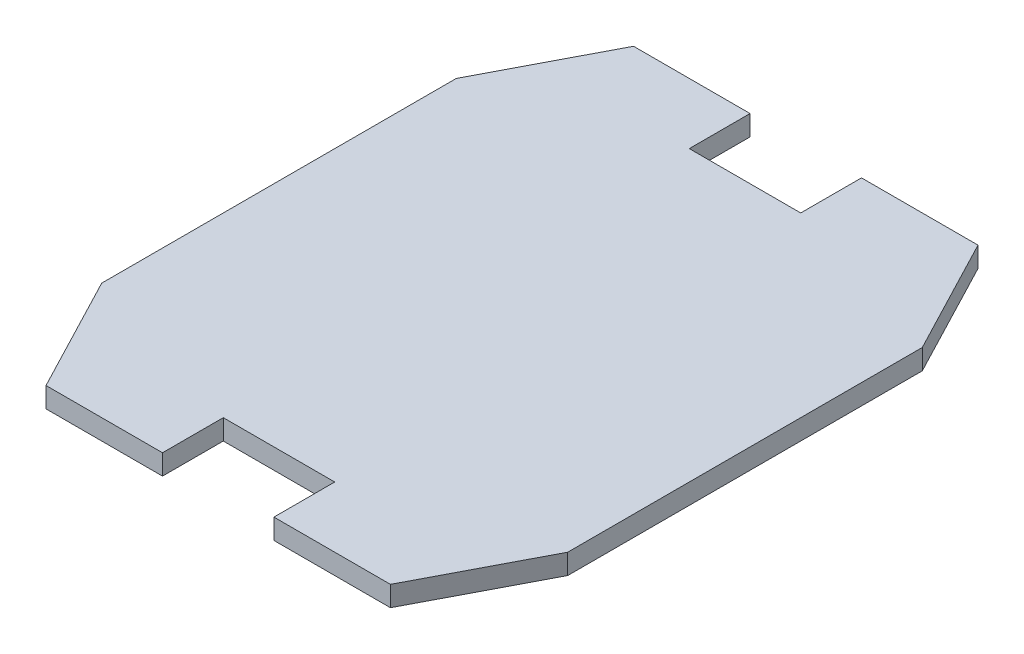
ISO-10303-21;
HEADER;
FILE_DESCRIPTION(('STEP AP214'),'2;1');
FILE_NAME('part.step','',(''),(''),'','','');
FILE_SCHEMA(('AUTOMOTIVE_DESIGN { 1 0 10303 214 1 1 1 1 }'));
ENDSEC;
DATA;
#1=APPLICATION_CONTEXT('core data for automotive mechanical design processes');
#2=APPLICATION_PROTOCOL_DEFINITION('international standard','automotive_design',2000,#1);
#3=PRODUCT_CONTEXT('',#1,'mechanical');
#4=PRODUCT('Part','Part','',(#3));
#5=PRODUCT_RELATED_PRODUCT_CATEGORY('part','',(#4));
#6=PRODUCT_DEFINITION_FORMATION('','',#4);
#7=PRODUCT_DEFINITION_CONTEXT('part definition',#1,'design');
#8=PRODUCT_DEFINITION('design','',#6,#7);
#9=PRODUCT_DEFINITION_SHAPE('','',#8);
#10=(LENGTH_UNIT() NAMED_UNIT(*) SI_UNIT(.MILLI.,.METRE.));
#11=(NAMED_UNIT(*) PLANE_ANGLE_UNIT() SI_UNIT($,.RADIAN.));
#12=(NAMED_UNIT(*) SI_UNIT($,.STERADIAN.) SOLID_ANGLE_UNIT());
#13=UNCERTAINTY_MEASURE_WITH_UNIT(LENGTH_MEASURE(1.E-05),#10,'distance_accuracy_value','');
#14=(GEOMETRIC_REPRESENTATION_CONTEXT(3) GLOBAL_UNCERTAINTY_ASSIGNED_CONTEXT((#13)) GLOBAL_UNIT_ASSIGNED_CONTEXT((#10,
#11,#12)) REPRESENTATION_CONTEXT('',''));
#15=CARTESIAN_POINT('',(0.,0.,0.));
#16=DIRECTION('',(0.,0.,1.));
#17=DIRECTION('',(1.,0.,0.));
#18=AXIS2_PLACEMENT_3D('',#15,#16,#17);
#19=CARTESIAN_POINT('',(-155.,10.,-145.));
#20=DIRECTION('',(0.,0.,1.));
#21=DIRECTION('',(1.,0.,0.));
#22=AXIS2_PLACEMENT_3D('',#19,#20,#21);
#23=PLANE('',#22);
#24=DIRECTION('',(0.,1.,0.));
#25=VECTOR('',#24,1.);
#26=CARTESIAN_POINT('',(-27.5,0.,-145.));
#27=LINE('',#26,#25);
#28=CARTESIAN_POINT('',(-27.5,0.,-145.));
#29=VERTEX_POINT('',#28);
#30=CARTESIAN_POINT('',(-27.5,10.,-145.));
#31=VERTEX_POINT('',#30);
#32=EDGE_CURVE('E158',#29,#31,#27,.T.);
#33=ORIENTED_EDGE('',*,*,#32,.F.);
#34=DIRECTION('',(-1.,0.,0.));
#35=VECTOR('',#34,1.);
#36=CARTESIAN_POINT('',(-155.,0.,-145.));
#37=LINE('',#36,#35);
#38=CARTESIAN_POINT('',(-85.,0.,-145.));
#39=VERTEX_POINT('',#38);
#40=EDGE_CURVE('E180',#29,#39,#37,.T.);
#41=ORIENTED_EDGE('',*,*,#40,.T.);
#42=DIRECTION('',(0.,1.,0.));
#43=VECTOR('',#42,1.);
#44=CARTESIAN_POINT('',(-85.,0.,-145.));
#45=LINE('',#44,#43);
#46=CARTESIAN_POINT('',(-85.,10.,-145.));
#47=VERTEX_POINT('',#46);
#48=EDGE_CURVE('E178',#39,#47,#45,.T.);
#49=ORIENTED_EDGE('',*,*,#48,.T.);
#50=DIRECTION('',(-1.,0.,0.));
#51=VECTOR('',#50,1.);
#52=CARTESIAN_POINT('',(-155.,10.,-145.));
#53=LINE('',#52,#51);
#54=EDGE_CURVE('E185',#31,#47,#53,.T.);
#55=ORIENTED_EDGE('',*,*,#54,.F.);
#56=EDGE_LOOP('',(#33,#41,#49,#55));
#57=FACE_BOUND('',#56,.T.);
#58=ADVANCED_FACE('F39',(#57),#23,.F.);
#59=CARTESIAN_POINT('',(-155.,10.,145.));
#60=DIRECTION('',(0.,0.,-1.));
#61=DIRECTION('',(-1.,0.,0.));
#62=AXIS2_PLACEMENT_3D('',#59,#60,#61);
#63=PLANE('',#62);
#64=DIRECTION('',(0.,1.,0.));
#65=VECTOR('',#64,1.);
#66=CARTESIAN_POINT('',(27.5,0.,145.));
#67=LINE('',#66,#65);
#68=CARTESIAN_POINT('',(27.5,0.,145.));
#69=VERTEX_POINT('',#68);
#70=CARTESIAN_POINT('',(27.5,10.,145.));
#71=VERTEX_POINT('',#70);
#72=EDGE_CURVE('E243',#69,#71,#67,.T.);
#73=ORIENTED_EDGE('',*,*,#72,.F.);
#74=DIRECTION('',(1.,0.,0.));
#75=VECTOR('',#74,1.);
#76=CARTESIAN_POINT('',(-155.,0.,145.));
#77=LINE('',#76,#75);
#78=CARTESIAN_POINT('',(85.,0.,145.));
#79=VERTEX_POINT('',#78);
#80=EDGE_CURVE('E176',#69,#79,#77,.T.);
#81=ORIENTED_EDGE('',*,*,#80,.T.);
#82=DIRECTION('',(0.,1.,0.));
#83=VECTOR('',#82,1.);
#84=CARTESIAN_POINT('',(85.,0.,145.));
#85=LINE('',#84,#83);
#86=CARTESIAN_POINT('',(85.,10.,145.));
#87=VERTEX_POINT('',#86);
#88=EDGE_CURVE('E202',#79,#87,#85,.T.);
#89=ORIENTED_EDGE('',*,*,#88,.T.);
#90=DIRECTION('',(1.,0.,0.));
#91=VECTOR('',#90,1.);
#92=CARTESIAN_POINT('',(-155.,10.,145.));
#93=LINE('',#92,#91);
#94=EDGE_CURVE('E48',#71,#87,#93,.T.);
#95=ORIENTED_EDGE('',*,*,#94,.F.);
#96=EDGE_LOOP('',(#73,#81,#89,#95));
#97=FACE_BOUND('',#96,.T.);
#98=ADVANCED_FACE('F319',(#97),#63,.F.);
#99=CARTESIAN_POINT('',(85.,0.,-145.));
#100=VERTEX_POINT('',#99);
#101=CARTESIAN_POINT('',(27.5,0.,-145.));
#102=VERTEX_POINT('',#101);
#103=EDGE_CURVE('E166',#100,#102,#37,.T.);
#104=ORIENTED_EDGE('',*,*,#103,.T.);
#105=DIRECTION('',(0.,1.,0.));
#106=VECTOR('',#105,1.);
#107=CARTESIAN_POINT('',(27.5,0.,-145.));
#108=LINE('',#107,#106);
#109=CARTESIAN_POINT('',(27.5,10.,-145.));
#110=VERTEX_POINT('',#109);
#111=EDGE_CURVE('E152',#102,#110,#108,.T.);
#112=ORIENTED_EDGE('',*,*,#111,.T.);
#113=CARTESIAN_POINT('',(85.,10.,-145.));
#114=VERTEX_POINT('',#113);
#115=EDGE_CURVE('E179',#114,#110,#53,.T.);
#116=ORIENTED_EDGE('',*,*,#115,.F.);
#117=DIRECTION('',(0.,1.,0.));
#118=VECTOR('',#117,1.);
#119=CARTESIAN_POINT('',(85.,0.,-145.));
#120=LINE('',#119,#118);
#121=EDGE_CURVE('E174',#100,#114,#120,.T.);
#122=ORIENTED_EDGE('',*,*,#121,.F.);
#123=EDGE_LOOP('',(#104,#112,#116,#122));
#124=FACE_BOUND('',#123,.T.);
#125=ADVANCED_FACE('F41',(#124),#23,.F.);
#126=CARTESIAN_POINT('',(-85.,0.,145.));
#127=VERTEX_POINT('',#126);
#128=CARTESIAN_POINT('',(-27.5,0.,145.));
#129=VERTEX_POINT('',#128);
#130=EDGE_CURVE('E43',#127,#129,#77,.T.);
#131=ORIENTED_EDGE('',*,*,#130,.T.);
#132=DIRECTION('',(0.,1.,0.));
#133=VECTOR('',#132,1.);
#134=CARTESIAN_POINT('',(-27.5,0.,145.));
#135=LINE('',#134,#133);
#136=CARTESIAN_POINT('',(-27.5,10.,145.));
#137=VERTEX_POINT('',#136);
#138=EDGE_CURVE('E252',#129,#137,#135,.T.);
#139=ORIENTED_EDGE('',*,*,#138,.T.);
#140=CARTESIAN_POINT('',(-85.,10.,145.));
#141=VERTEX_POINT('',#140);
#142=EDGE_CURVE('E11',#141,#137,#93,.T.);
#143=ORIENTED_EDGE('',*,*,#142,.F.);
#144=DIRECTION('',(0.,1.,0.));
#145=VECTOR('',#144,1.);
#146=CARTESIAN_POINT('',(-85.,0.,145.));
#147=LINE('',#146,#145);
#148=EDGE_CURVE('E208',#127,#141,#147,.T.);
#149=ORIENTED_EDGE('',*,*,#148,.F.);
#150=EDGE_LOOP('',(#131,#139,#143,#149));
#151=FACE_BOUND('',#150,.T.);
#152=ADVANCED_FACE('F283',(#151),#63,.F.);
#153=CARTESIAN_POINT('',(0.,10.,0.));
#154=DIRECTION('',(0.,1.,0.));
#155=DIRECTION('',(0.,0.,1.));
#156=AXIS2_PLACEMENT_3D('',#153,#154,#155);
#157=PLANE('',#156);
#158=DIRECTION('',(0.,0.,-1.));
#159=VECTOR('',#158,1.);
#160=CARTESIAN_POINT('',(27.5,10.,145.));
#161=LINE('',#160,#159);
#162=CARTESIAN_POINT('',(27.5,10.,115.));
#163=VERTEX_POINT('',#162);
#164=EDGE_CURVE('E242',#71,#163,#161,.T.);
#165=ORIENTED_EDGE('',*,*,#164,.F.);
#166=ORIENTED_EDGE('',*,*,#94,.T.);
#167=DIRECTION('',(-0.462566006718739,0.,0.886584846153079));
#168=VECTOR('',#167,1.);
#169=CARTESIAN_POINT('',(115.000000001957,10.,87.5));
#170=LINE('',#169,#168);
#171=CARTESIAN_POINT('',(115.000000001957,10.,87.5));
#172=VERTEX_POINT('',#171);
#173=EDGE_CURVE('E184',#172,#87,#170,.T.);
#174=ORIENTED_EDGE('',*,*,#173,.F.);
#175=DIRECTION('',(0.,0.,1.));
#176=VECTOR('',#175,1.);
#177=CARTESIAN_POINT('',(115.000000001957,10.,-87.5));
#178=LINE('',#177,#176);
#179=CARTESIAN_POINT('',(115.000000001957,10.,-87.5));
#180=VERTEX_POINT('',#179);
#181=EDGE_CURVE('E196',#180,#172,#178,.T.);
#182=ORIENTED_EDGE('',*,*,#181,.F.);
#183=DIRECTION('',(0.462566006718739,0.,0.886584846153079));
#184=VECTOR('',#183,1.);
#185=CARTESIAN_POINT('',(85.,10.,-145.));
#186=LINE('',#185,#184);
#187=EDGE_CURVE('E191',#114,#180,#186,.T.);
#188=ORIENTED_EDGE('',*,*,#187,.F.);
#189=ORIENTED_EDGE('',*,*,#115,.T.);
#190=DIRECTION('',(0.,0.,-1.));
#191=VECTOR('',#190,1.);
#192=CARTESIAN_POINT('',(27.5,10.,-145.));
#193=LINE('',#192,#191);
#194=CARTESIAN_POINT('',(27.5,10.,-115.));
#195=VERTEX_POINT('',#194);
#196=EDGE_CURVE('E155',#195,#110,#193,.T.);
#197=ORIENTED_EDGE('',*,*,#196,.F.);
#198=DIRECTION('',(1.,0.,0.));
#199=VECTOR('',#198,1.);
#200=CARTESIAN_POINT('',(27.5,10.,-115.));
#201=LINE('',#200,#199);
#202=CARTESIAN_POINT('',(-27.5,10.,-115.));
#203=VERTEX_POINT('',#202);
#204=EDGE_CURVE('E175',#203,#195,#201,.T.);
#205=ORIENTED_EDGE('',*,*,#204,.F.);
#206=DIRECTION('',(0.,0.,1.));
#207=VECTOR('',#206,1.);
#208=CARTESIAN_POINT('',(-27.5,10.,-145.));
#209=LINE('',#208,#207);
#210=EDGE_CURVE('E265',#31,#203,#209,.T.);
#211=ORIENTED_EDGE('',*,*,#210,.F.);
#212=ORIENTED_EDGE('',*,*,#54,.T.);
#213=DIRECTION('',(0.462566006718739,0.,-0.886584846153079));
#214=VECTOR('',#213,1.);
#215=CARTESIAN_POINT('',(-85.,10.,-145.));
#216=LINE('',#215,#214);
#217=CARTESIAN_POINT('',(-115.000000001957,10.,-87.5));
#218=VERTEX_POINT('',#217);
#219=EDGE_CURVE('E218',#218,#47,#216,.T.);
#220=ORIENTED_EDGE('',*,*,#219,.F.);
#221=DIRECTION('',(0.,0.,-1.));
#222=VECTOR('',#221,1.);
#223=CARTESIAN_POINT('',(-115.000000001957,10.,-87.5));
#224=LINE('',#223,#222);
#225=CARTESIAN_POINT('',(-115.000000001957,10.,87.5));
#226=VERTEX_POINT('',#225);
#227=EDGE_CURVE('E225',#226,#218,#224,.T.);
#228=ORIENTED_EDGE('',*,*,#227,.F.);
#229=DIRECTION('',(-0.462566006718739,0.,-0.886584846153079));
#230=VECTOR('',#229,1.);
#231=CARTESIAN_POINT('',(-115.000000001957,10.,87.5));
#232=LINE('',#231,#230);
#233=EDGE_CURVE('E192',#141,#226,#232,.T.);
#234=ORIENTED_EDGE('',*,*,#233,.F.);
#235=ORIENTED_EDGE('',*,*,#142,.T.);
#236=DIRECTION('',(0.,0.,1.));
#237=VECTOR('',#236,1.);
#238=CARTESIAN_POINT('',(-27.5,10.,145.));
#239=LINE('',#238,#237);
#240=CARTESIAN_POINT('',(-27.5,10.,115.));
#241=VERTEX_POINT('',#240);
#242=EDGE_CURVE('E238',#241,#137,#239,.T.);
#243=ORIENTED_EDGE('',*,*,#242,.F.);
#244=DIRECTION('',(-1.,0.,0.));
#245=VECTOR('',#244,1.);
#246=CARTESIAN_POINT('',(27.5,10.,115.));
#247=LINE('',#246,#245);
#248=EDGE_CURVE('E250',#163,#241,#247,.T.);
#249=ORIENTED_EDGE('',*,*,#248,.F.);
#250=EDGE_LOOP('',(#165,#166,#174,#182,#188,#189,#197,#205,#211,#212,#220,#228,#234,#235,#243,#249));
#251=FACE_BOUND('',#250,.T.);
#252=ADVANCED_FACE('F295',(#251),#157,.T.);
#253=CARTESIAN_POINT('',(0.,0.,0.));
#254=DIRECTION('',(0.,1.,0.));
#255=DIRECTION('',(0.,0.,1.));
#256=AXIS2_PLACEMENT_3D('',#253,#254,#255);
#257=PLANE('',#256);
#258=DIRECTION('',(1.,0.,0.));
#259=VECTOR('',#258,1.);
#260=CARTESIAN_POINT('',(27.5,0.,-115.));
#261=LINE('',#260,#259);
#262=CARTESIAN_POINT('',(-27.5,0.,-115.));
#263=VERTEX_POINT('',#262);
#264=CARTESIAN_POINT('',(27.5,0.,-115.));
#265=VERTEX_POINT('',#264);
#266=EDGE_CURVE('E163',#263,#265,#261,.T.);
#267=ORIENTED_EDGE('',*,*,#266,.T.);
#268=DIRECTION('',(0.,0.,-1.));
#269=VECTOR('',#268,1.);
#270=CARTESIAN_POINT('',(27.5,0.,-145.));
#271=LINE('',#270,#269);
#272=EDGE_CURVE('E57',#265,#102,#271,.T.);
#273=ORIENTED_EDGE('',*,*,#272,.T.);
#274=ORIENTED_EDGE('',*,*,#103,.F.);
#275=DIRECTION('',(0.462566006718739,0.,0.886584846153079));
#276=VECTOR('',#275,1.);
#277=CARTESIAN_POINT('',(85.,0.,-145.));
#278=LINE('',#277,#276);
#279=CARTESIAN_POINT('',(115.000000001957,0.,-87.5));
#280=VERTEX_POINT('',#279);
#281=EDGE_CURVE('E182',#100,#280,#278,.T.);
#282=ORIENTED_EDGE('',*,*,#281,.T.);
#283=DIRECTION('',(0.,0.,1.));
#284=VECTOR('',#283,1.);
#285=CARTESIAN_POINT('',(115.000000001957,0.,-87.5));
#286=LINE('',#285,#284);
#287=CARTESIAN_POINT('',(115.000000001957,0.,87.5));
#288=VERTEX_POINT('',#287);
#289=EDGE_CURVE('E187',#280,#288,#286,.T.);
#290=ORIENTED_EDGE('',*,*,#289,.T.);
#291=DIRECTION('',(-0.462566006718739,0.,0.886584846153079));
#292=VECTOR('',#291,1.);
#293=CARTESIAN_POINT('',(115.000000001957,0.,87.5));
#294=LINE('',#293,#292);
#295=EDGE_CURVE('E186',#288,#79,#294,.T.);
#296=ORIENTED_EDGE('',*,*,#295,.T.);
#297=ORIENTED_EDGE('',*,*,#80,.F.);
#298=DIRECTION('',(0.,0.,-1.));
#299=VECTOR('',#298,1.);
#300=CARTESIAN_POINT('',(27.5,0.,145.));
#301=LINE('',#300,#299);
#302=CARTESIAN_POINT('',(27.5,0.,115.));
#303=VERTEX_POINT('',#302);
#304=EDGE_CURVE('E232',#69,#303,#301,.T.);
#305=ORIENTED_EDGE('',*,*,#304,.T.);
#306=DIRECTION('',(-1.,0.,0.));
#307=VECTOR('',#306,1.);
#308=CARTESIAN_POINT('',(27.5,0.,115.));
#309=LINE('',#308,#307);
#310=CARTESIAN_POINT('',(-27.5,0.,115.));
#311=VERTEX_POINT('',#310);
#312=EDGE_CURVE('E237',#303,#311,#309,.T.);
#313=ORIENTED_EDGE('',*,*,#312,.T.);
#314=DIRECTION('',(0.,0.,1.));
#315=VECTOR('',#314,1.);
#316=CARTESIAN_POINT('',(-27.5,0.,145.));
#317=LINE('',#316,#315);
#318=EDGE_CURVE('E63',#311,#129,#317,.T.);
#319=ORIENTED_EDGE('',*,*,#318,.T.);
#320=ORIENTED_EDGE('',*,*,#130,.F.);
#321=DIRECTION('',(-0.462566006718739,0.,-0.886584846153079));
#322=VECTOR('',#321,1.);
#323=CARTESIAN_POINT('',(-115.000000001957,0.,87.5));
#324=LINE('',#323,#322);
#325=CARTESIAN_POINT('',(-115.000000001957,0.,87.5));
#326=VERTEX_POINT('',#325);
#327=EDGE_CURVE('E224',#127,#326,#324,.T.);
#328=ORIENTED_EDGE('',*,*,#327,.T.);
#329=DIRECTION('',(0.,0.,-1.));
#330=VECTOR('',#329,1.);
#331=CARTESIAN_POINT('',(-115.000000001957,0.,-87.5));
#332=LINE('',#331,#330);
#333=CARTESIAN_POINT('',(-115.000000001957,0.,-87.5));
#334=VERTEX_POINT('',#333);
#335=EDGE_CURVE('E229',#326,#334,#332,.T.);
#336=ORIENTED_EDGE('',*,*,#335,.T.);
#337=DIRECTION('',(0.462566006718739,0.,-0.886584846153079));
#338=VECTOR('',#337,1.);
#339=CARTESIAN_POINT('',(-85.,0.,-145.));
#340=LINE('',#339,#338);
#341=EDGE_CURVE('E215',#334,#39,#340,.T.);
#342=ORIENTED_EDGE('',*,*,#341,.T.);
#343=ORIENTED_EDGE('',*,*,#40,.F.);
#344=DIRECTION('',(0.,0.,1.));
#345=VECTOR('',#344,1.);
#346=CARTESIAN_POINT('',(-27.5,0.,-145.));
#347=LINE('',#346,#345);
#348=EDGE_CURVE('E171',#29,#263,#347,.T.);
#349=ORIENTED_EDGE('',*,*,#348,.T.);
#350=EDGE_LOOP('',(#267,#273,#274,#282,#290,#296,#297,#305,#313,#319,#320,#328,#336,#342,#343,#349));
#351=FACE_BOUND('',#350,.T.);
#352=ADVANCED_FACE('F168',(#351),#257,.F.);
#353=CARTESIAN_POINT('',(115.000000001957,0.,87.5));
#354=DIRECTION('',(-0.886584846153079,0.,-0.462566006718739));
#355=DIRECTION('',(-0.462566006718739,0.,0.88658484615308));
#356=AXIS2_PLACEMENT_3D('',#353,#354,#355);
#357=PLANE('',#356);
#358=ORIENTED_EDGE('',*,*,#173,.T.);
#359=ORIENTED_EDGE('',*,*,#88,.F.);
#360=ORIENTED_EDGE('',*,*,#295,.F.);
#361=DIRECTION('',(0.,1.,0.));
#362=VECTOR('',#361,1.);
#363=CARTESIAN_POINT('',(115.000000001957,0.,87.5));
#364=LINE('',#363,#362);
#365=EDGE_CURVE('E201',#288,#172,#364,.T.);
#366=ORIENTED_EDGE('',*,*,#365,.T.);
#367=EDGE_LOOP('',(#358,#359,#360,#366));
#368=FACE_BOUND('',#367,.T.);
#369=ADVANCED_FACE('F331',(#368),#357,.F.);
#370=CARTESIAN_POINT('',(115.000000001957,0.,-87.5));
#371=DIRECTION('',(-1.,0.,0.));
#372=DIRECTION('',(0.,0.,1.));
#373=AXIS2_PLACEMENT_3D('',#370,#371,#372);
#374=PLANE('',#373);
#375=ORIENTED_EDGE('',*,*,#181,.T.);
#376=ORIENTED_EDGE('',*,*,#365,.F.);
#377=ORIENTED_EDGE('',*,*,#289,.F.);
#378=DIRECTION('',(0.,1.,0.));
#379=VECTOR('',#378,1.);
#380=CARTESIAN_POINT('',(115.000000001957,0.,-87.5));
#381=LINE('',#380,#379);
#382=EDGE_CURVE('E210',#280,#180,#381,.T.);
#383=ORIENTED_EDGE('',*,*,#382,.T.);
#384=EDGE_LOOP('',(#375,#376,#377,#383));
#385=FACE_BOUND('',#384,.T.);
#386=ADVANCED_FACE('F312',(#385),#374,.F.);
#387=CARTESIAN_POINT('',(85.,0.,-145.));
#388=DIRECTION('',(-0.886584846153079,0.,0.462566006718739));
#389=DIRECTION('',(0.462566006718739,0.,0.88658484615308));
#390=AXIS2_PLACEMENT_3D('',#387,#388,#389);
#391=PLANE('',#390);
#392=ORIENTED_EDGE('',*,*,#187,.T.);
#393=ORIENTED_EDGE('',*,*,#382,.F.);
#394=ORIENTED_EDGE('',*,*,#281,.F.);
#395=ORIENTED_EDGE('',*,*,#121,.T.);
#396=EDGE_LOOP('',(#392,#393,#394,#395));
#397=FACE_BOUND('',#396,.T.);
#398=ADVANCED_FACE('F306',(#397),#391,.F.);
#399=CARTESIAN_POINT('',(-85.,0.,-145.));
#400=DIRECTION('',(0.886584846153079,0.,0.462566006718739));
#401=DIRECTION('',(0.462566006718739,0.,-0.88658484615308));
#402=AXIS2_PLACEMENT_3D('',#399,#400,#401);
#403=PLANE('',#402);
#404=ORIENTED_EDGE('',*,*,#219,.T.);
#405=ORIENTED_EDGE('',*,*,#48,.F.);
#406=ORIENTED_EDGE('',*,*,#341,.F.);
#407=DIRECTION('',(0.,1.,0.));
#408=VECTOR('',#407,1.);
#409=CARTESIAN_POINT('',(-115.000000001957,0.,-87.5));
#410=LINE('',#409,#408);
#411=EDGE_CURVE('E212',#334,#218,#410,.T.);
#412=ORIENTED_EDGE('',*,*,#411,.T.);
#413=EDGE_LOOP('',(#404,#405,#406,#412));
#414=FACE_BOUND('',#413,.T.);
#415=ADVANCED_FACE('F302',(#414),#403,.F.);
#416=CARTESIAN_POINT('',(-115.000000001957,0.,-87.5));
#417=DIRECTION('',(1.,0.,0.));
#418=DIRECTION('',(0.,0.,-1.));
#419=AXIS2_PLACEMENT_3D('',#416,#417,#418);
#420=PLANE('',#419);
#421=ORIENTED_EDGE('',*,*,#227,.T.);
#422=ORIENTED_EDGE('',*,*,#411,.F.);
#423=ORIENTED_EDGE('',*,*,#335,.F.);
#424=DIRECTION('',(0.,1.,0.));
#425=VECTOR('',#424,1.);
#426=CARTESIAN_POINT('',(-115.000000001957,0.,87.5));
#427=LINE('',#426,#425);
#428=EDGE_CURVE('E211',#326,#226,#427,.T.);
#429=ORIENTED_EDGE('',*,*,#428,.T.);
#430=EDGE_LOOP('',(#421,#422,#423,#429));
#431=FACE_BOUND('',#430,.T.);
#432=ADVANCED_FACE('F305',(#431),#420,.F.);
#433=CARTESIAN_POINT('',(-115.000000001957,0.,87.5));
#434=DIRECTION('',(0.886584846153079,0.,-0.462566006718739));
#435=DIRECTION('',(-0.462566006718739,0.,-0.88658484615308));
#436=AXIS2_PLACEMENT_3D('',#433,#434,#435);
#437=PLANE('',#436);
#438=ORIENTED_EDGE('',*,*,#233,.T.);
#439=ORIENTED_EDGE('',*,*,#428,.F.);
#440=ORIENTED_EDGE('',*,*,#327,.F.);
#441=ORIENTED_EDGE('',*,*,#148,.T.);
#442=EDGE_LOOP('',(#438,#439,#440,#441));
#443=FACE_BOUND('',#442,.T.);
#444=ADVANCED_FACE('F296',(#443),#437,.F.);
#445=CARTESIAN_POINT('',(-27.5,0.,145.));
#446=DIRECTION('',(-1.,0.,0.));
#447=DIRECTION('',(0.,0.,1.));
#448=AXIS2_PLACEMENT_3D('',#445,#446,#447);
#449=PLANE('',#448);
#450=ORIENTED_EDGE('',*,*,#242,.T.);
#451=ORIENTED_EDGE('',*,*,#138,.F.);
#452=ORIENTED_EDGE('',*,*,#318,.F.);
#453=DIRECTION('',(0.,1.,0.));
#454=VECTOR('',#453,1.);
#455=CARTESIAN_POINT('',(-27.5,0.,115.));
#456=LINE('',#455,#454);
#457=EDGE_CURVE('E251',#311,#241,#456,.T.);
#458=ORIENTED_EDGE('',*,*,#457,.T.);
#459=EDGE_LOOP('',(#450,#451,#452,#458));
#460=FACE_BOUND('',#459,.T.);
#461=ADVANCED_FACE('F292',(#460),#449,.F.);
#462=CARTESIAN_POINT('',(27.5,0.,115.));
#463=DIRECTION('',(0.,0.,-1.));
#464=DIRECTION('',(-1.,0.,0.));
#465=AXIS2_PLACEMENT_3D('',#462,#463,#464);
#466=PLANE('',#465);
#467=ORIENTED_EDGE('',*,*,#248,.T.);
#468=ORIENTED_EDGE('',*,*,#457,.F.);
#469=ORIENTED_EDGE('',*,*,#312,.F.);
#470=DIRECTION('',(0.,1.,0.));
#471=VECTOR('',#470,1.);
#472=CARTESIAN_POINT('',(27.5,0.,115.));
#473=LINE('',#472,#471);
#474=EDGE_CURVE('E259',#303,#163,#473,.T.);
#475=ORIENTED_EDGE('',*,*,#474,.T.);
#476=EDGE_LOOP('',(#467,#468,#469,#475));
#477=FACE_BOUND('',#476,.T.);
#478=ADVANCED_FACE('F286',(#477),#466,.F.);
#479=CARTESIAN_POINT('',(27.5,0.,145.));
#480=DIRECTION('',(1.,0.,0.));
#481=DIRECTION('',(0.,0.,-1.));
#482=AXIS2_PLACEMENT_3D('',#479,#480,#481);
#483=PLANE('',#482);
#484=ORIENTED_EDGE('',*,*,#164,.T.);
#485=ORIENTED_EDGE('',*,*,#474,.F.);
#486=ORIENTED_EDGE('',*,*,#304,.F.);
#487=ORIENTED_EDGE('',*,*,#72,.T.);
#488=EDGE_LOOP('',(#484,#485,#486,#487));
#489=FACE_BOUND('',#488,.T.);
#490=ADVANCED_FACE('F349',(#489),#483,.F.);
#491=CARTESIAN_POINT('',(27.5,0.,-145.));
#492=DIRECTION('',(1.,0.,0.));
#493=DIRECTION('',(0.,0.,-1.));
#494=AXIS2_PLACEMENT_3D('',#491,#492,#493);
#495=PLANE('',#494);
#496=ORIENTED_EDGE('',*,*,#196,.T.);
#497=ORIENTED_EDGE('',*,*,#111,.F.);
#498=ORIENTED_EDGE('',*,*,#272,.F.);
#499=DIRECTION('',(0.,1.,0.));
#500=VECTOR('',#499,1.);
#501=CARTESIAN_POINT('',(27.5,0.,-115.));
#502=LINE('',#501,#500);
#503=EDGE_CURVE('E203',#265,#195,#502,.T.);
#504=ORIENTED_EDGE('',*,*,#503,.T.);
#505=EDGE_LOOP('',(#496,#497,#498,#504));
#506=FACE_BOUND('',#505,.T.);
#507=ADVANCED_FACE('F154',(#506),#495,.F.);
#508=CARTESIAN_POINT('',(27.5,0.,-115.));
#509=DIRECTION('',(0.,0.,1.));
#510=DIRECTION('',(1.,0.,0.));
#511=AXIS2_PLACEMENT_3D('',#508,#509,#510);
#512=PLANE('',#511);
#513=ORIENTED_EDGE('',*,*,#204,.T.);
#514=ORIENTED_EDGE('',*,*,#503,.F.);
#515=ORIENTED_EDGE('',*,*,#266,.F.);
#516=DIRECTION('',(0.,1.,0.));
#517=VECTOR('',#516,1.);
#518=CARTESIAN_POINT('',(-27.5,0.,-115.));
#519=LINE('',#518,#517);
#520=EDGE_CURVE('E257',#263,#203,#519,.T.);
#521=ORIENTED_EDGE('',*,*,#520,.T.);
#522=EDGE_LOOP('',(#513,#514,#515,#521));
#523=FACE_BOUND('',#522,.T.);
#524=ADVANCED_FACE('F358',(#523),#512,.F.);
#525=CARTESIAN_POINT('',(-27.5,0.,-145.));
#526=DIRECTION('',(-1.,0.,0.));
#527=DIRECTION('',(0.,0.,1.));
#528=AXIS2_PLACEMENT_3D('',#525,#526,#527);
#529=PLANE('',#528);
#530=ORIENTED_EDGE('',*,*,#210,.T.);
#531=ORIENTED_EDGE('',*,*,#520,.F.);
#532=ORIENTED_EDGE('',*,*,#348,.F.);
#533=ORIENTED_EDGE('',*,*,#32,.T.);
#534=EDGE_LOOP('',(#530,#531,#532,#533));
#535=FACE_BOUND('',#534,.T.);
#536=ADVANCED_FACE('F271',(#535),#529,.F.);
#537=CLOSED_SHELL('',(#58,#98,#125,#152,#252,#352,#369,#386,#398,#415,#432,#444,#461,#478,#490,
#507,#524,#536));
#538=MANIFOLD_SOLID_BREP('B2',#537);
#539=ADVANCED_BREP_SHAPE_REPRESENTATION('',(#18,#538),#14);
#540=SHAPE_DEFINITION_REPRESENTATION(#9,#539);
ENDSEC;
END-ISO-10303-21;
